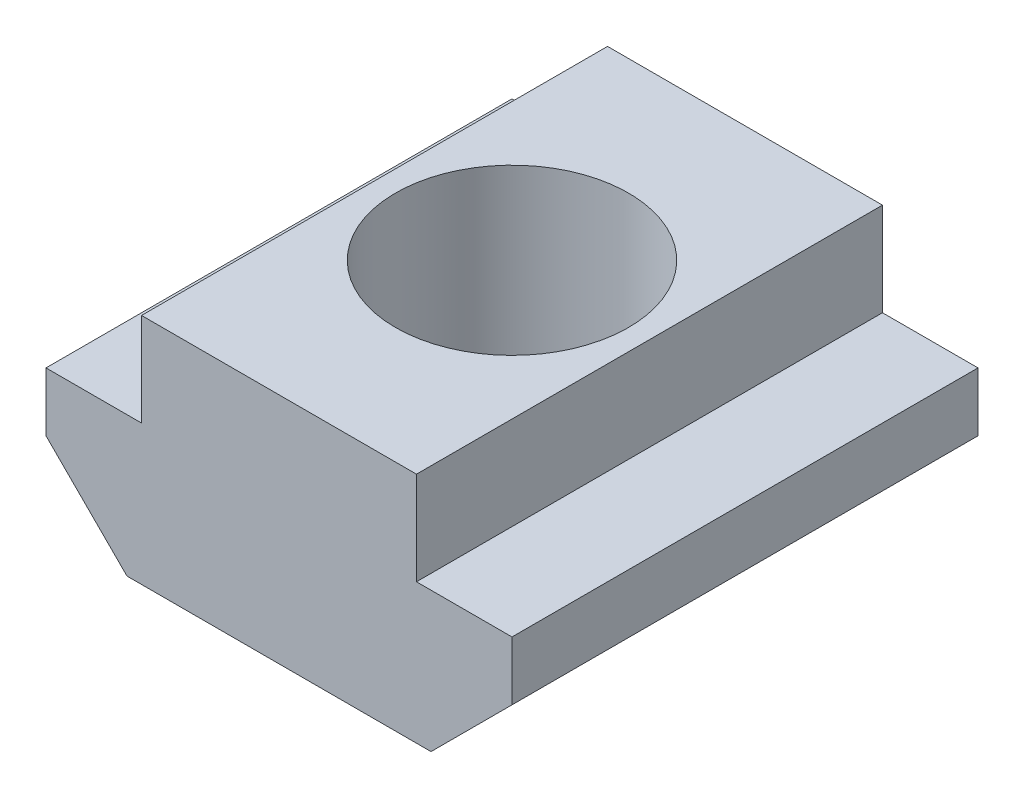
ISO-10303-21;
HEADER;
FILE_DESCRIPTION(('STEP AP214'),'2;1');
FILE_NAME('part.step','',(''),(''),'','','');
FILE_SCHEMA(('AUTOMOTIVE_DESIGN { 1 0 10303 214 1 1 1 1 }'));
ENDSEC;
DATA;
#1=APPLICATION_CONTEXT('core data for automotive mechanical design processes');
#2=APPLICATION_PROTOCOL_DEFINITION('international standard','automotive_design',2000,#1);
#3=PRODUCT_CONTEXT('',#1,'mechanical');
#4=PRODUCT('Part','Part','',(#3));
#5=PRODUCT_RELATED_PRODUCT_CATEGORY('part','',(#4));
#6=PRODUCT_DEFINITION_FORMATION('','',#4);
#7=PRODUCT_DEFINITION_CONTEXT('part definition',#1,'design');
#8=PRODUCT_DEFINITION('design','',#6,#7);
#9=PRODUCT_DEFINITION_SHAPE('','',#8);
#10=(LENGTH_UNIT() NAMED_UNIT(*) SI_UNIT(.MILLI.,.METRE.));
#11=(NAMED_UNIT(*) PLANE_ANGLE_UNIT() SI_UNIT($,.RADIAN.));
#12=(NAMED_UNIT(*) SI_UNIT($,.STERADIAN.) SOLID_ANGLE_UNIT());
#13=UNCERTAINTY_MEASURE_WITH_UNIT(LENGTH_MEASURE(1.E-05),#10,'distance_accuracy_value','');
#14=(GEOMETRIC_REPRESENTATION_CONTEXT(3) GLOBAL_UNCERTAINTY_ASSIGNED_CONTEXT((#13)) GLOBAL_UNIT_ASSIGNED_CONTEXT((#10,
#11,#12)) REPRESENTATION_CONTEXT('',''));
#15=CARTESIAN_POINT('',(0.,0.,0.));
#16=DIRECTION('',(0.,0.,1.));
#17=DIRECTION('',(1.,0.,0.));
#18=AXIS2_PLACEMENT_3D('',#15,#16,#17);
#19=CARTESIAN_POINT('',(-12.2437281150785,-0.348434552617839,10.));
#20=DIRECTION('',(0.707106781186549,0.707106781186546,0.));
#21=DIRECTION('',(-0.707106781186546,0.707106781186549,0.));
#22=AXIS2_PLACEMENT_3D('',#19,#20,#21);
#23=PLANE('',#22);
#24=DIRECTION('',(0.707106781186546,-0.707106781186548,0.));
#25=VECTOR('',#24,1.);
#26=CARTESIAN_POINT('',(-12.2437281150785,-0.348434552617839,0.));
#27=LINE('',#26,#25);
#28=CARTESIAN_POINT('',(-12.2437281150785,-0.348434552617839,0.));
#29=VERTEX_POINT('',#28);
#30=CARTESIAN_POINT('',(-10.5060872587399,-2.08607540895643,0.));
#31=VERTEX_POINT('',#30);
#32=EDGE_CURVE('E144',#29,#31,#27,.T.);
#33=ORIENTED_EDGE('',*,*,#32,.T.);
#34=DIRECTION('',(0.,0.,-1.));
#35=VECTOR('',#34,1.);
#36=CARTESIAN_POINT('',(-10.5060872587399,-2.08607540895643,10.));
#37=LINE('',#36,#35);
#38=CARTESIAN_POINT('',(-10.5060872587399,-2.08607540895643,10.));
#39=VERTEX_POINT('',#38);
#40=EDGE_CURVE('E11',#39,#31,#37,.T.);
#41=ORIENTED_EDGE('',*,*,#40,.F.);
#42=DIRECTION('',(0.707106781186546,-0.707106781186548,0.));
#43=VECTOR('',#42,1.);
#44=CARTESIAN_POINT('',(-12.2437281150785,-0.348434552617839,10.));
#45=LINE('',#44,#43);
#46=CARTESIAN_POINT('',(-12.2437281150785,-0.348434552617839,10.));
#47=VERTEX_POINT('',#46);
#48=EDGE_CURVE('E163',#47,#39,#45,.T.);
#49=ORIENTED_EDGE('',*,*,#48,.F.);
#50=DIRECTION('',(0.,0.,-1.));
#51=VECTOR('',#50,1.);
#52=CARTESIAN_POINT('',(-12.2437281150785,-0.348434552617839,10.));
#53=LINE('',#52,#51);
#54=EDGE_CURVE('E140',#47,#29,#53,.T.);
#55=ORIENTED_EDGE('',*,*,#54,.T.);
#56=EDGE_LOOP('',(#33,#41,#49,#55));
#57=FACE_BOUND('',#56,.T.);
#58=ADVANCED_FACE('F36',(#57),#23,.F.);
#59=CARTESIAN_POINT('',(-10.5060872587399,-2.08607540895643,10.));
#60=DIRECTION('',(0.,1.,0.));
#61=DIRECTION('',(0.,0.,1.));
#62=AXIS2_PLACEMENT_3D('',#59,#60,#61);
#63=PLANE('',#62);
#64=CARTESIAN_POINT('',(-7.2437281150785,-2.08607540895643,5.));
#65=DIRECTION('',(0.,1.,0.));
#66=DIRECTION('',(0.,0.,1.));
#67=AXIS2_PLACEMENT_3D('',#64,#65,#66);
#68=CIRCLE('',#67,2.5);
#69=CARTESIAN_POINT('',(-7.2437281150785,-2.08607540895643,7.5));
#70=VERTEX_POINT('',#69);
#71=EDGE_CURVE('E148',#70,#70,#68,.F.);
#72=ORIENTED_EDGE('',*,*,#71,.F.);
#73=EDGE_LOOP('',(#72));
#74=FACE_BOUND('',#73,.T.);
#75=DIRECTION('',(1.,0.,0.));
#76=VECTOR('',#75,1.);
#77=CARTESIAN_POINT('',(-10.5060872587399,-2.08607540895643,0.));
#78=LINE('',#77,#76);
#79=CARTESIAN_POINT('',(-3.98136897141709,-2.08607540895643,0.));
#80=VERTEX_POINT('',#79);
#81=EDGE_CURVE('E147',#31,#80,#78,.T.);
#82=ORIENTED_EDGE('',*,*,#81,.T.);
#83=DIRECTION('',(0.,0.,-1.));
#84=VECTOR('',#83,1.);
#85=CARTESIAN_POINT('',(-3.98136897141709,-2.08607540895643,10.));
#86=LINE('',#85,#84);
#87=CARTESIAN_POINT('',(-3.98136897141709,-2.08607540895643,10.));
#88=VERTEX_POINT('',#87);
#89=EDGE_CURVE('E44',#88,#80,#86,.T.);
#90=ORIENTED_EDGE('',*,*,#89,.F.);
#91=DIRECTION('',(1.,0.,0.));
#92=VECTOR('',#91,1.);
#93=CARTESIAN_POINT('',(-10.5060872587399,-2.08607540895643,10.));
#94=LINE('',#93,#92);
#95=EDGE_CURVE('E101',#39,#88,#94,.T.);
#96=ORIENTED_EDGE('',*,*,#95,.F.);
#97=ORIENTED_EDGE('',*,*,#40,.T.);
#98=EDGE_LOOP('',(#82,#90,#96,#97));
#99=FACE_BOUND('',#98,.T.);
#100=ADVANCED_FACE('F240',(#74,#99),#63,.F.);
#101=CARTESIAN_POINT('',(-3.98136897141709,-2.08607540895643,10.));
#102=DIRECTION('',(-0.707106781186549,0.707106781186546,0.));
#103=DIRECTION('',(-0.707106781186546,-0.707106781186549,0.));
#104=AXIS2_PLACEMENT_3D('',#101,#102,#103);
#105=PLANE('',#104);
#106=DIRECTION('',(0.707106781186546,0.707106781186548,0.));
#107=VECTOR('',#106,1.);
#108=CARTESIAN_POINT('',(-3.98136897141709,-2.08607540895643,0.));
#109=LINE('',#108,#107);
#110=CARTESIAN_POINT('',(-2.2437281150785,-0.348434552617839,0.));
#111=VERTEX_POINT('',#110);
#112=EDGE_CURVE('E150',#80,#111,#109,.T.);
#113=ORIENTED_EDGE('',*,*,#112,.T.);
#114=DIRECTION('',(0.,0.,-1.));
#115=VECTOR('',#114,1.);
#116=CARTESIAN_POINT('',(-2.2437281150785,-0.348434552617839,10.));
#117=LINE('',#116,#115);
#118=CARTESIAN_POINT('',(-2.2437281150785,-0.348434552617839,10.));
#119=VERTEX_POINT('',#118);
#120=EDGE_CURVE('E176',#119,#111,#117,.T.);
#121=ORIENTED_EDGE('',*,*,#120,.F.);
#122=DIRECTION('',(0.707106781186546,0.707106781186548,0.));
#123=VECTOR('',#122,1.);
#124=CARTESIAN_POINT('',(-3.98136897141709,-2.08607540895643,10.));
#125=LINE('',#124,#123);
#126=EDGE_CURVE('E184',#88,#119,#125,.T.);
#127=ORIENTED_EDGE('',*,*,#126,.F.);
#128=ORIENTED_EDGE('',*,*,#89,.T.);
#129=EDGE_LOOP('',(#113,#121,#127,#128));
#130=FACE_BOUND('',#129,.T.);
#131=ADVANCED_FACE('F182',(#130),#105,.F.);
#132=CARTESIAN_POINT('',(-2.2437281150785,-0.348434552617839,10.));
#133=DIRECTION('',(-1.,0.,0.));
#134=DIRECTION('',(0.,0.,1.));
#135=AXIS2_PLACEMENT_3D('',#132,#133,#134);
#136=PLANE('',#135);
#137=DIRECTION('',(0.,1.,0.));
#138=VECTOR('',#137,1.);
#139=CARTESIAN_POINT('',(-2.2437281150785,-0.348434552617839,0.));
#140=LINE('',#139,#138);
#141=CARTESIAN_POINT('',(-2.2437281150785,0.913924591043569,0.));
#142=VERTEX_POINT('',#141);
#143=EDGE_CURVE('E152',#111,#142,#140,.T.);
#144=ORIENTED_EDGE('',*,*,#143,.T.);
#145=DIRECTION('',(0.,0.,-1.));
#146=VECTOR('',#145,1.);
#147=CARTESIAN_POINT('',(-2.2437281150785,0.913924591043569,10.));
#148=LINE('',#147,#146);
#149=CARTESIAN_POINT('',(-2.2437281150785,0.913924591043569,10.));
#150=VERTEX_POINT('',#149);
#151=EDGE_CURVE('E173',#150,#142,#148,.T.);
#152=ORIENTED_EDGE('',*,*,#151,.F.);
#153=DIRECTION('',(0.,1.,0.));
#154=VECTOR('',#153,1.);
#155=CARTESIAN_POINT('',(-2.2437281150785,-0.348434552617839,10.));
#156=LINE('',#155,#154);
#157=EDGE_CURVE('E202',#119,#150,#156,.T.);
#158=ORIENTED_EDGE('',*,*,#157,.F.);
#159=ORIENTED_EDGE('',*,*,#120,.T.);
#160=EDGE_LOOP('',(#144,#152,#158,#159));
#161=FACE_BOUND('',#160,.T.);
#162=ADVANCED_FACE('F193',(#161),#136,.F.);
#163=CARTESIAN_POINT('',(-2.2437281150785,0.913924591043569,10.));
#164=DIRECTION('',(0.,-1.,0.));
#165=DIRECTION('',(1.,0.,0.));
#166=AXIS2_PLACEMENT_3D('',#163,#164,#165);
#167=PLANE('',#166);
#168=DIRECTION('',(-1.,0.,0.));
#169=VECTOR('',#168,1.);
#170=CARTESIAN_POINT('',(-2.2437281150785,0.913924591043569,0.));
#171=LINE('',#170,#169);
#172=CARTESIAN_POINT('',(-4.2937281150785,0.913924591043569,0.));
#173=VERTEX_POINT('',#172);
#174=EDGE_CURVE('E154',#142,#173,#171,.T.);
#175=ORIENTED_EDGE('',*,*,#174,.T.);
#176=DIRECTION('',(0.,0.,-1.));
#177=VECTOR('',#176,1.);
#178=CARTESIAN_POINT('',(-4.2937281150785,0.913924591043569,10.));
#179=LINE('',#178,#177);
#180=CARTESIAN_POINT('',(-4.2937281150785,0.913924591043569,10.));
#181=VERTEX_POINT('',#180);
#182=EDGE_CURVE('E170',#181,#173,#179,.T.);
#183=ORIENTED_EDGE('',*,*,#182,.F.);
#184=DIRECTION('',(-1.,0.,0.));
#185=VECTOR('',#184,1.);
#186=CARTESIAN_POINT('',(-2.2437281150785,0.913924591043569,10.));
#187=LINE('',#186,#185);
#188=EDGE_CURVE('E199',#150,#181,#187,.T.);
#189=ORIENTED_EDGE('',*,*,#188,.F.);
#190=ORIENTED_EDGE('',*,*,#151,.T.);
#191=EDGE_LOOP('',(#175,#183,#189,#190));
#192=FACE_BOUND('',#191,.T.);
#193=ADVANCED_FACE('F197',(#192),#167,.F.);
#194=CARTESIAN_POINT('',(-4.2937281150785,0.913924591043569,10.));
#195=DIRECTION('',(-1.,0.,0.));
#196=DIRECTION('',(0.,0.,1.));
#197=AXIS2_PLACEMENT_3D('',#194,#195,#196);
#198=PLANE('',#197);
#199=DIRECTION('',(0.,1.,0.));
#200=VECTOR('',#199,1.);
#201=CARTESIAN_POINT('',(-4.2937281150785,0.913924591043569,0.));
#202=LINE('',#201,#200);
#203=CARTESIAN_POINT('',(-4.2937281150785,2.91392459104357,0.));
#204=VERTEX_POINT('',#203);
#205=EDGE_CURVE('E156',#173,#204,#202,.T.);
#206=ORIENTED_EDGE('',*,*,#205,.T.);
#207=DIRECTION('',(0.,0.,-1.));
#208=VECTOR('',#207,1.);
#209=CARTESIAN_POINT('',(-4.2937281150785,2.91392459104357,10.));
#210=LINE('',#209,#208);
#211=CARTESIAN_POINT('',(-4.2937281150785,2.91392459104357,10.));
#212=VERTEX_POINT('',#211);
#213=EDGE_CURVE('E167',#212,#204,#210,.T.);
#214=ORIENTED_EDGE('',*,*,#213,.F.);
#215=DIRECTION('',(0.,1.,0.));
#216=VECTOR('',#215,1.);
#217=CARTESIAN_POINT('',(-4.2937281150785,0.913924591043569,10.));
#218=LINE('',#217,#216);
#219=EDGE_CURVE('E201',#181,#212,#218,.T.);
#220=ORIENTED_EDGE('',*,*,#219,.F.);
#221=ORIENTED_EDGE('',*,*,#182,.T.);
#222=EDGE_LOOP('',(#206,#214,#220,#221));
#223=FACE_BOUND('',#222,.T.);
#224=ADVANCED_FACE('F222',(#223),#198,.F.);
#225=CARTESIAN_POINT('',(-4.2937281150785,2.91392459104357,10.));
#226=DIRECTION('',(0.,-1.,0.));
#227=DIRECTION('',(0.,0.,-1.));
#228=AXIS2_PLACEMENT_3D('',#225,#226,#227);
#229=PLANE('',#228);
#230=CARTESIAN_POINT('',(-7.2437281150785,2.91392459104357,5.));
#231=DIRECTION('',(0.,1.,0.));
#232=DIRECTION('',(0.,0.,1.));
#233=AXIS2_PLACEMENT_3D('',#230,#231,#232);
#234=CIRCLE('',#233,2.5);
#235=CARTESIAN_POINT('',(-7.2437281150785,2.91392459104357,7.5));
#236=VERTEX_POINT('',#235);
#237=EDGE_CURVE('E212',#236,#236,#234,.T.);
#238=ORIENTED_EDGE('',*,*,#237,.F.);
#239=EDGE_LOOP('',(#238));
#240=FACE_BOUND('',#239,.T.);
#241=DIRECTION('',(-1.,0.,0.));
#242=VECTOR('',#241,1.);
#243=CARTESIAN_POINT('',(-4.2937281150785,2.91392459104357,0.));
#244=LINE('',#243,#242);
#245=CARTESIAN_POINT('',(-10.1937281150785,2.91392459104357,0.));
#246=VERTEX_POINT('',#245);
#247=EDGE_CURVE('E158',#204,#246,#244,.T.);
#248=ORIENTED_EDGE('',*,*,#247,.T.);
#249=DIRECTION('',(0.,0.,-1.));
#250=VECTOR('',#249,1.);
#251=CARTESIAN_POINT('',(-10.1937281150785,2.91392459104357,10.));
#252=LINE('',#251,#250);
#253=CARTESIAN_POINT('',(-10.1937281150785,2.91392459104357,10.));
#254=VERTEX_POINT('',#253);
#255=EDGE_CURVE('E135',#254,#246,#252,.T.);
#256=ORIENTED_EDGE('',*,*,#255,.F.);
#257=DIRECTION('',(-1.,0.,0.));
#258=VECTOR('',#257,1.);
#259=CARTESIAN_POINT('',(-4.2937281150785,2.91392459104357,10.));
#260=LINE('',#259,#258);
#261=EDGE_CURVE('E126',#212,#254,#260,.T.);
#262=ORIENTED_EDGE('',*,*,#261,.F.);
#263=ORIENTED_EDGE('',*,*,#213,.T.);
#264=EDGE_LOOP('',(#248,#256,#262,#263));
#265=FACE_BOUND('',#264,.T.);
#266=ADVANCED_FACE('F219',(#240,#265),#229,.F.);
#267=CARTESIAN_POINT('',(-10.1937281150785,2.91392459104357,10.));
#268=DIRECTION('',(1.,0.,0.));
#269=DIRECTION('',(0.,0.,-1.));
#270=AXIS2_PLACEMENT_3D('',#267,#268,#269);
#271=PLANE('',#270);
#272=DIRECTION('',(0.,-1.,0.));
#273=VECTOR('',#272,1.);
#274=CARTESIAN_POINT('',(-10.1937281150785,2.91392459104357,0.));
#275=LINE('',#274,#273);
#276=CARTESIAN_POINT('',(-10.1937281150785,0.913924591043569,0.));
#277=VERTEX_POINT('',#276);
#278=EDGE_CURVE('E134',#246,#277,#275,.T.);
#279=ORIENTED_EDGE('',*,*,#278,.T.);
#280=DIRECTION('',(0.,0.,-1.));
#281=VECTOR('',#280,1.);
#282=CARTESIAN_POINT('',(-10.1937281150785,0.913924591043569,10.));
#283=LINE('',#282,#281);
#284=CARTESIAN_POINT('',(-10.1937281150785,0.913924591043569,10.));
#285=VERTEX_POINT('',#284);
#286=EDGE_CURVE('E131',#285,#277,#283,.T.);
#287=ORIENTED_EDGE('',*,*,#286,.F.);
#288=DIRECTION('',(0.,-1.,0.));
#289=VECTOR('',#288,1.);
#290=CARTESIAN_POINT('',(-10.1937281150785,2.91392459104357,10.));
#291=LINE('',#290,#289);
#292=EDGE_CURVE('E120',#254,#285,#291,.T.);
#293=ORIENTED_EDGE('',*,*,#292,.F.);
#294=ORIENTED_EDGE('',*,*,#255,.T.);
#295=EDGE_LOOP('',(#279,#287,#293,#294));
#296=FACE_BOUND('',#295,.T.);
#297=ADVANCED_FACE('F132',(#296),#271,.F.);
#298=CARTESIAN_POINT('',(-10.1937281150785,0.913924591043569,10.));
#299=DIRECTION('',(0.,-1.,0.));
#300=DIRECTION('',(1.,0.,0.));
#301=AXIS2_PLACEMENT_3D('',#298,#299,#300);
#302=PLANE('',#301);
#303=DIRECTION('',(-1.,0.,0.));
#304=VECTOR('',#303,1.);
#305=CARTESIAN_POINT('',(-10.1937281150785,0.913924591043569,0.));
#306=LINE('',#305,#304);
#307=CARTESIAN_POINT('',(-12.2437281150785,0.913924591043569,0.));
#308=VERTEX_POINT('',#307);
#309=EDGE_CURVE('E87',#277,#308,#306,.T.);
#310=ORIENTED_EDGE('',*,*,#309,.T.);
#311=DIRECTION('',(0.,0.,-1.));
#312=VECTOR('',#311,1.);
#313=CARTESIAN_POINT('',(-12.2437281150785,0.913924591043569,10.));
#314=LINE('',#313,#312);
#315=CARTESIAN_POINT('',(-12.2437281150785,0.913924591043569,10.));
#316=VERTEX_POINT('',#315);
#317=EDGE_CURVE('E136',#316,#308,#314,.T.);
#318=ORIENTED_EDGE('',*,*,#317,.F.);
#319=DIRECTION('',(-1.,0.,0.));
#320=VECTOR('',#319,1.);
#321=CARTESIAN_POINT('',(-10.1937281150785,0.913924591043569,10.));
#322=LINE('',#321,#320);
#323=EDGE_CURVE('E124',#285,#316,#322,.T.);
#324=ORIENTED_EDGE('',*,*,#323,.F.);
#325=ORIENTED_EDGE('',*,*,#286,.T.);
#326=EDGE_LOOP('',(#310,#318,#324,#325));
#327=FACE_BOUND('',#326,.T.);
#328=ADVANCED_FACE('F138',(#327),#302,.F.);
#329=CARTESIAN_POINT('',(-12.2437281150785,0.913924591043569,10.));
#330=DIRECTION('',(1.,0.,0.));
#331=DIRECTION('',(0.,0.,-1.));
#332=AXIS2_PLACEMENT_3D('',#329,#330,#331);
#333=PLANE('',#332);
#334=DIRECTION('',(0.,-1.,0.));
#335=VECTOR('',#334,1.);
#336=CARTESIAN_POINT('',(-12.2437281150785,0.913924591043569,0.));
#337=LINE('',#336,#335);
#338=EDGE_CURVE('E93',#308,#29,#337,.T.);
#339=ORIENTED_EDGE('',*,*,#338,.T.);
#340=ORIENTED_EDGE('',*,*,#54,.F.);
#341=DIRECTION('',(0.,-1.,0.));
#342=VECTOR('',#341,1.);
#343=CARTESIAN_POINT('',(-12.2437281150785,0.913924591043569,10.));
#344=LINE('',#343,#342);
#345=EDGE_CURVE('E52',#316,#47,#344,.T.);
#346=ORIENTED_EDGE('',*,*,#345,.F.);
#347=ORIENTED_EDGE('',*,*,#317,.T.);
#348=EDGE_LOOP('',(#339,#340,#346,#347));
#349=FACE_BOUND('',#348,.T.);
#350=ADVANCED_FACE('F229',(#349),#333,.F.);
#351=CARTESIAN_POINT('',(0.,0.,10.));
#352=DIRECTION('',(0.,0.,1.));
#353=DIRECTION('',(1.,0.,0.));
#354=AXIS2_PLACEMENT_3D('',#351,#352,#353);
#355=PLANE('',#354);
#356=ORIENTED_EDGE('',*,*,#48,.T.);
#357=ORIENTED_EDGE('',*,*,#95,.T.);
#358=ORIENTED_EDGE('',*,*,#126,.T.);
#359=ORIENTED_EDGE('',*,*,#157,.T.);
#360=ORIENTED_EDGE('',*,*,#188,.T.);
#361=ORIENTED_EDGE('',*,*,#219,.T.);
#362=ORIENTED_EDGE('',*,*,#261,.T.);
#363=ORIENTED_EDGE('',*,*,#292,.T.);
#364=ORIENTED_EDGE('',*,*,#323,.T.);
#365=ORIENTED_EDGE('',*,*,#345,.T.);
#366=EDGE_LOOP('',(#356,#357,#358,#359,#360,#361,#362,#363,#364,#365));
#367=FACE_BOUND('',#366,.T.);
#368=ADVANCED_FACE('F122',(#367),#355,.T.);
#369=CARTESIAN_POINT('',(0.,0.,0.));
#370=DIRECTION('',(0.,0.,1.));
#371=DIRECTION('',(1.,0.,0.));
#372=AXIS2_PLACEMENT_3D('',#369,#370,#371);
#373=PLANE('',#372);
#374=ORIENTED_EDGE('',*,*,#32,.F.);
#375=ORIENTED_EDGE('',*,*,#338,.F.);
#376=ORIENTED_EDGE('',*,*,#309,.F.);
#377=ORIENTED_EDGE('',*,*,#278,.F.);
#378=ORIENTED_EDGE('',*,*,#247,.F.);
#379=ORIENTED_EDGE('',*,*,#205,.F.);
#380=ORIENTED_EDGE('',*,*,#174,.F.);
#381=ORIENTED_EDGE('',*,*,#143,.F.);
#382=ORIENTED_EDGE('',*,*,#112,.F.);
#383=ORIENTED_EDGE('',*,*,#81,.F.);
#384=EDGE_LOOP('',(#374,#375,#376,#377,#378,#379,#380,#381,#382,#383));
#385=FACE_BOUND('',#384,.T.);
#386=ADVANCED_FACE('F188',(#385),#373,.F.);
#387=CARTESIAN_POINT('',(-7.2437281150785,-2.08707540895643,5.));
#388=DIRECTION('',(0.,1.,0.));
#389=DIRECTION('',(0.,0.,1.));
#390=AXIS2_PLACEMENT_3D('',#387,#388,#389);
#391=CYLINDRICAL_SURFACE('',#390,2.5);
#392=ORIENTED_EDGE('',*,*,#237,.T.);
#393=EDGE_LOOP('',(#392));
#394=FACE_BOUND('',#393,.T.);
#395=ORIENTED_EDGE('',*,*,#71,.T.);
#396=EDGE_LOOP('',(#395));
#397=FACE_BOUND('',#396,.T.);
#398=ADVANCED_FACE('F216',(#394,#397),#391,.F.);
#399=CLOSED_SHELL('',(#58,#100,#131,#162,#193,#224,#266,#297,#328,#350,#368,#386,#398));
#400=MANIFOLD_SOLID_BREP('B2',#399);
#401=ADVANCED_BREP_SHAPE_REPRESENTATION('',(#18,#400),#14);
#402=SHAPE_DEFINITION_REPRESENTATION(#9,#401);
ENDSEC;
END-ISO-10303-21;
